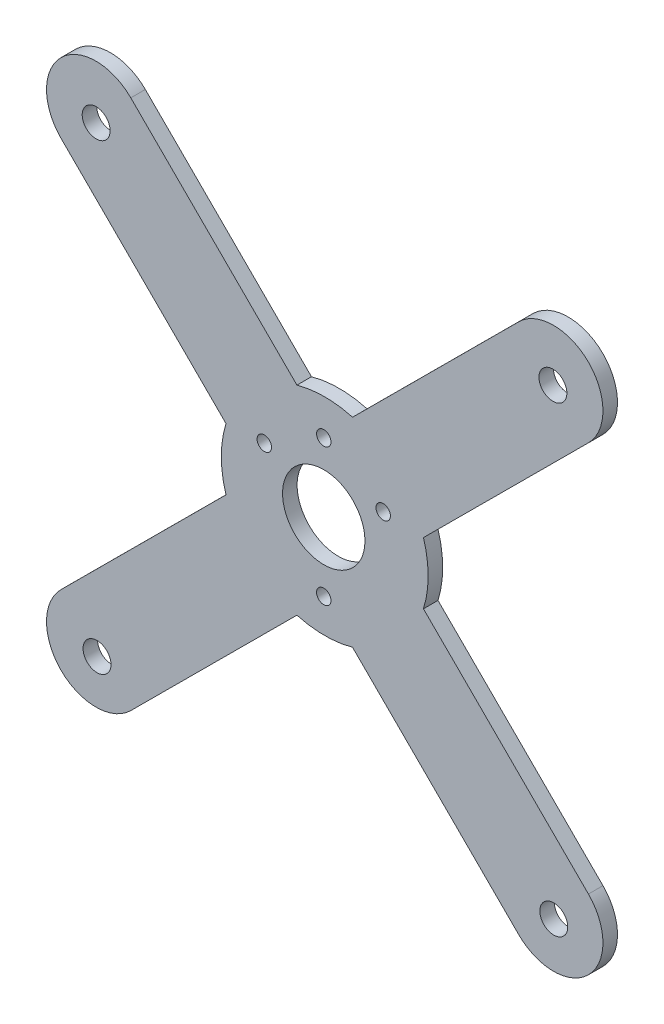
ISO-10303-21;
HEADER;
FILE_DESCRIPTION(('STEP AP214'),'2;1');
FILE_NAME('part.step','',(''),(''),'','','');
FILE_SCHEMA(('AUTOMOTIVE_DESIGN { 1 0 10303 214 1 1 1 1 }'));
ENDSEC;
DATA;
#1=APPLICATION_CONTEXT('core data for automotive mechanical design processes');
#2=APPLICATION_PROTOCOL_DEFINITION('international standard','automotive_design',2000,#1);
#3=PRODUCT_CONTEXT('',#1,'mechanical');
#4=PRODUCT('Part','Part','',(#3));
#5=PRODUCT_RELATED_PRODUCT_CATEGORY('part','',(#4));
#6=PRODUCT_DEFINITION_FORMATION('','',#4);
#7=PRODUCT_DEFINITION_CONTEXT('part definition',#1,'design');
#8=PRODUCT_DEFINITION('design','',#6,#7);
#9=PRODUCT_DEFINITION_SHAPE('','',#8);
#10=(LENGTH_UNIT() NAMED_UNIT(*) SI_UNIT(.MILLI.,.METRE.));
#11=(NAMED_UNIT(*) PLANE_ANGLE_UNIT() SI_UNIT($,.RADIAN.));
#12=(NAMED_UNIT(*) SI_UNIT($,.STERADIAN.) SOLID_ANGLE_UNIT());
#13=UNCERTAINTY_MEASURE_WITH_UNIT(LENGTH_MEASURE(1.E-05),#10,'distance_accuracy_value','');
#14=(GEOMETRIC_REPRESENTATION_CONTEXT(3) GLOBAL_UNCERTAINTY_ASSIGNED_CONTEXT((#13)) GLOBAL_UNIT_ASSIGNED_CONTEXT((#10,
#11,#12)) REPRESENTATION_CONTEXT('',''));
#15=CARTESIAN_POINT('',(0.,0.,0.));
#16=DIRECTION('',(0.,0.,1.));
#17=DIRECTION('',(1.,0.,0.));
#18=AXIS2_PLACEMENT_3D('',#15,#16,#17);
#19=CARTESIAN_POINT('',(-49.7743654585426,50.6103078211912,3.175));
#20=DIRECTION('',(0.,0.,-1.));
#21=DIRECTION('',(-1.,0.,0.));
#22=AXIS2_PLACEMENT_3D('',#19,#20,#21);
#23=PLANE('',#22);
#24=CARTESIAN_POINT('',(-49.7743654585426,50.6103078211912,3.175));
#25=DIRECTION('',(0.,0.,1.));
#26=DIRECTION('',(-1.,0.,0.));
#27=AXIS2_PLACEMENT_3D('',#24,#25,#26);
#28=CIRCLE('',#27,10.7897531368883);
#29=CARTESIAN_POINT('',(-42.1549727802943,58.2499169715107,3.175));
#30=VERTEX_POINT('',#29);
#31=CARTESIAN_POINT('',(-57.3937581367911,42.9706986708717,3.175));
#32=VERTEX_POINT('',#31);
#33=EDGE_CURVE('E212',#30,#32,#28,.T.);
#34=ORIENTED_EDGE('',*,*,#33,.T.);
#35=DIRECTION('',(0.708042997221225,-0.706169323948573,0.));
#36=VECTOR('',#35,1.);
#37=CARTESIAN_POINT('',(-57.3937581367911,42.9706986708717,3.175));
#38=LINE('',#37,#36);
#39=CARTESIAN_POINT('',(-21.3539668145918,7.02627838407185,3.175));
#40=VERTEX_POINT('',#39);
#41=EDGE_CURVE('E120',#32,#40,#38,.T.);
#42=ORIENTED_EDGE('',*,*,#41,.T.);
#43=CARTESIAN_POINT('',(0.212184023995116,0.287188930352053,3.175));
#44=DIRECTION('',(0.,0.,1.));
#45=DIRECTION('',(1.,0.,0.));
#46=AXIS2_PLACEMENT_3D('',#43,#44,#45);
#47=CIRCLE('',#46,22.5945610414967);
#48=CARTESIAN_POINT('',(-21.3539668145918,-6.45190052336774,3.175));
#49=VERTEX_POINT('',#48);
#50=EDGE_CURVE('E251',#40,#49,#47,.T.);
#51=ORIENTED_EDGE('',*,*,#50,.T.);
#52=DIRECTION('',(-0.708042997221225,-0.706169323948573,0.));
#53=VECTOR('',#52,1.);
#54=CARTESIAN_POINT('',(-57.3937581367911,-42.3963208101676,3.175));
#55=LINE('',#54,#53);
#56=CARTESIAN_POINT('',(-57.3937581367911,-42.3963208101676,3.175));
#57=VERTEX_POINT('',#56);
#58=EDGE_CURVE('E270',#49,#57,#55,.T.);
#59=ORIENTED_EDGE('',*,*,#58,.T.);
#60=CARTESIAN_POINT('',(-49.7743654585426,-50.0359299604871,3.175));
#61=DIRECTION('',(0.,0.,1.));
#62=DIRECTION('',(1.,0.,0.));
#63=AXIS2_PLACEMENT_3D('',#60,#61,#62);
#64=CIRCLE('',#63,10.7897531368883);
#65=CARTESIAN_POINT('',(-42.1549727802942,-57.6755391108066,3.175));
#66=VERTEX_POINT('',#65);
#67=EDGE_CURVE('E267',#57,#66,#64,.T.);
#68=ORIENTED_EDGE('',*,*,#67,.T.);
#69=DIRECTION('',(0.708042997221225,0.706169323948573,0.));
#70=VECTOR('',#69,1.);
#71=CARTESIAN_POINT('',(-42.1549727802943,-57.6755391108066,3.175));
#72=LINE('',#71,#70);
#73=CARTESIAN_POINT('',(-5.859634798099,-21.47624840959,3.175));
#74=VERTEX_POINT('',#73);
#75=EDGE_CURVE('E269',#66,#74,#72,.T.);
#76=ORIENTED_EDGE('',*,*,#75,.T.);
#77=CARTESIAN_POINT('',(0.212184023995116,0.287188930352053,3.175));
#78=DIRECTION('',(0.,0.,1.));
#79=DIRECTION('',(1.,0.,0.));
#80=AXIS2_PLACEMENT_3D('',#77,#78,#79);
#81=CIRCLE('',#80,22.5945610414967);
#82=CARTESIAN_POINT('',(6.28400284608923,-21.47624840959,3.175));
#83=VERTEX_POINT('',#82);
#84=EDGE_CURVE('E272',#74,#83,#81,.T.);
#85=ORIENTED_EDGE('',*,*,#84,.T.);
#86=DIRECTION('',(0.708042997221225,-0.706169323948573,0.));
#87=VECTOR('',#86,1.);
#88=CARTESIAN_POINT('',(42.5793408282845,-57.6755391108066,3.175));
#89=LINE('',#88,#87);
#90=CARTESIAN_POINT('',(42.5793408282845,-57.6755391108066,3.175));
#91=VERTEX_POINT('',#90);
#92=EDGE_CURVE('E278',#83,#91,#89,.T.);
#93=ORIENTED_EDGE('',*,*,#92,.T.);
#94=CARTESIAN_POINT('',(50.1987335065329,-50.035929960487,3.175));
#95=DIRECTION('',(0.,0.,1.));
#96=DIRECTION('',(-1.,0.,0.));
#97=AXIS2_PLACEMENT_3D('',#94,#95,#96);
#98=CIRCLE('',#97,10.7897531368883);
#99=CARTESIAN_POINT('',(57.8181261847813,-42.3963208101676,3.175));
#100=VERTEX_POINT('',#99);
#101=EDGE_CURVE('E280',#91,#100,#98,.T.);
#102=ORIENTED_EDGE('',*,*,#101,.T.);
#103=DIRECTION('',(-0.708042997221225,0.706169323948573,0.));
#104=VECTOR('',#103,1.);
#105=CARTESIAN_POINT('',(57.8181261847813,-42.3963208101676,3.175));
#106=LINE('',#105,#104);
#107=CARTESIAN_POINT('',(21.778334862582,-6.45190052336774,3.175));
#108=VERTEX_POINT('',#107);
#109=EDGE_CURVE('E282',#100,#108,#106,.T.);
#110=ORIENTED_EDGE('',*,*,#109,.T.);
#111=CARTESIAN_POINT('',(0.212184023995116,0.287188930352053,3.175));
#112=DIRECTION('',(0.,0.,1.));
#113=DIRECTION('',(1.,0.,0.));
#114=AXIS2_PLACEMENT_3D('',#111,#112,#113);
#115=CIRCLE('',#114,22.5945610414967);
#116=CARTESIAN_POINT('',(21.778334862582,7.02627838407184,3.175));
#117=VERTEX_POINT('',#116);
#118=EDGE_CURVE('E284',#108,#117,#115,.T.);
#119=ORIENTED_EDGE('',*,*,#118,.T.);
#120=DIRECTION('',(0.708042997221225,0.706169323948573,0.));
#121=VECTOR('',#120,1.);
#122=CARTESIAN_POINT('',(57.8181261847813,42.9706986708717,3.175));
#123=LINE('',#122,#121);
#124=CARTESIAN_POINT('',(57.8181261847813,42.9706986708717,3.175));
#125=VERTEX_POINT('',#124);
#126=EDGE_CURVE('E286',#117,#125,#123,.T.);
#127=ORIENTED_EDGE('',*,*,#126,.T.);
#128=CARTESIAN_POINT('',(50.1987335065329,50.6103078211912,3.175));
#129=DIRECTION('',(0.,0.,1.));
#130=DIRECTION('',(1.,0.,0.));
#131=AXIS2_PLACEMENT_3D('',#128,#129,#130);
#132=CIRCLE('',#131,10.7897531368883);
#133=CARTESIAN_POINT('',(42.5793408282845,58.2499169715107,3.175));
#134=VERTEX_POINT('',#133);
#135=EDGE_CURVE('E163',#125,#134,#132,.T.);
#136=ORIENTED_EDGE('',*,*,#135,.T.);
#137=DIRECTION('',(-0.708042997221225,-0.706169323948573,0.));
#138=VECTOR('',#137,1.);
#139=CARTESIAN_POINT('',(42.5793408282845,58.2499169715107,3.175));
#140=LINE('',#139,#138);
#141=CARTESIAN_POINT('',(6.28400284608923,22.0506262702941,3.175));
#142=VERTEX_POINT('',#141);
#143=EDGE_CURVE('E157',#134,#142,#140,.T.);
#144=ORIENTED_EDGE('',*,*,#143,.T.);
#145=CARTESIAN_POINT('',(0.212184023995116,0.287188930352053,3.175));
#146=DIRECTION('',(0.,0.,1.));
#147=DIRECTION('',(1.,0.,0.));
#148=AXIS2_PLACEMENT_3D('',#145,#146,#147);
#149=CIRCLE('',#148,22.5945610414967);
#150=CARTESIAN_POINT('',(-5.859634798099,22.0506262702941,3.175));
#151=VERTEX_POINT('',#150);
#152=EDGE_CURVE('E161',#142,#151,#149,.T.);
#153=ORIENTED_EDGE('',*,*,#152,.T.);
#154=DIRECTION('',(-0.708042997221225,0.706169323948573,0.));
#155=VECTOR('',#154,1.);
#156=CARTESIAN_POINT('',(-42.1549727802943,58.2499169715107,3.175));
#157=LINE('',#156,#155);
#158=EDGE_CURVE('E53',#151,#30,#157,.T.);
#159=ORIENTED_EDGE('',*,*,#158,.T.);
#160=EDGE_LOOP('',(#34,#42,#51,#59,#68,#76,#85,#93,#102,#110,#119,#127,#136,#144,#153,#159));
#161=FACE_BOUND('',#160,.T.);
#162=CARTESIAN_POINT('',(-49.7226597396435,49.7522118161619,3.175));
#163=DIRECTION('',(0.,0.,1.));
#164=DIRECTION('',(1.,0.,0.));
#165=AXIS2_PLACEMENT_3D('',#162,#163,#164);
#166=CIRCLE('',#165,3.05000000000001);
#167=CARTESIAN_POINT('',(-46.6726597396435,49.7522118161619,3.175));
#168=VERTEX_POINT('',#167);
#169=EDGE_CURVE('E185',#168,#168,#166,.T.);
#170=ORIENTED_EDGE('',*,*,#169,.F.);
#171=EDGE_LOOP('',(#170));
#172=FACE_BOUND('',#171,.T.);
#173=CARTESIAN_POINT('',(50.0628956848809,49.9959740344837,3.175));
#174=DIRECTION('',(0.,0.,1.));
#175=DIRECTION('',(-1.,0.,0.));
#176=AXIS2_PLACEMENT_3D('',#173,#174,#175);
#177=CIRCLE('',#176,3.05);
#178=CARTESIAN_POINT('',(47.0128956848809,49.9959740344837,3.175));
#179=VERTEX_POINT('',#178);
#180=EDGE_CURVE('E400',#179,#179,#177,.T.);
#181=ORIENTED_EDGE('',*,*,#180,.F.);
#182=EDGE_LOOP('',(#181));
#183=FACE_BOUND('',#182,.T.);
#184=CARTESIAN_POINT('',(50.250439225432,-50.8940259655163,3.175));
#185=DIRECTION('',(0.,0.,1.));
#186=DIRECTION('',(1.,0.,0.));
#187=AXIS2_PLACEMENT_3D('',#184,#185,#186);
#188=CIRCLE('',#187,3.05000000000002);
#189=CARTESIAN_POINT('',(53.3004392254321,-50.8940259655163,3.175));
#190=VERTEX_POINT('',#189);
#191=EDGE_CURVE('E394',#190,#190,#188,.T.);
#192=ORIENTED_EDGE('',*,*,#191,.F.);
#193=EDGE_LOOP('',(#192));
#194=FACE_BOUND('',#193,.T.);
#195=CARTESIAN_POINT('',(-49.5348861337291,-51.1415457768633,3.175));
#196=DIRECTION('',(0.,0.,1.));
#197=DIRECTION('',(-1.,0.,0.));
#198=AXIS2_PLACEMENT_3D('',#195,#196,#197);
#199=CIRCLE('',#198,3.05);
#200=CARTESIAN_POINT('',(-52.5848861337291,-51.1415457768633,3.175));
#201=VERTEX_POINT('',#200);
#202=EDGE_CURVE('E388',#201,#201,#199,.T.);
#203=ORIENTED_EDGE('',*,*,#202,.F.);
#204=EDGE_LOOP('',(#203));
#205=FACE_BOUND('',#204,.T.);
#206=CARTESIAN_POINT('',(0.,15.,3.175));
#207=DIRECTION('',(0.,0.,1.));
#208=DIRECTION('',(1.,0.,0.));
#209=AXIS2_PLACEMENT_3D('',#206,#207,#208);
#210=CIRCLE('',#209,1.57500000079265);
#211=CARTESIAN_POINT('',(1.57500000079265,15.,3.175));
#212=VERTEX_POINT('',#211);
#213=EDGE_CURVE('E382',#212,#212,#210,.T.);
#214=ORIENTED_EDGE('',*,*,#213,.F.);
#215=EDGE_LOOP('',(#214));
#216=FACE_BOUND('',#215,.T.);
#217=CARTESIAN_POINT('',(0.,0.,3.175));
#218=DIRECTION('',(0.,0.,1.));
#219=DIRECTION('',(1.,0.,0.));
#220=AXIS2_PLACEMENT_3D('',#217,#218,#219);
#221=CIRCLE('',#220,9.00000000079265);
#222=CARTESIAN_POINT('',(9.00000000079265,0.,3.175));
#223=VERTEX_POINT('',#222);
#224=EDGE_CURVE('E376',#223,#223,#221,.T.);
#225=ORIENTED_EDGE('',*,*,#224,.F.);
#226=EDGE_LOOP('',(#225));
#227=FACE_BOUND('',#226,.T.);
#228=CARTESIAN_POINT('',(-12.99,7.49999999999994,3.175));
#229=DIRECTION('',(0.,0.,1.));
#230=DIRECTION('',(1.,0.,0.));
#231=AXIS2_PLACEMENT_3D('',#228,#229,#230);
#232=CIRCLE('',#231,1.57500000079267);
#233=CARTESIAN_POINT('',(-11.4149999992073,7.49999999999994,3.175));
#234=VERTEX_POINT('',#233);
#235=EDGE_CURVE('E370',#234,#234,#232,.T.);
#236=ORIENTED_EDGE('',*,*,#235,.F.);
#237=EDGE_LOOP('',(#236));
#238=FACE_BOUND('',#237,.T.);
#239=CARTESIAN_POINT('',(12.99,7.49999999999997,3.175));
#240=DIRECTION('',(0.,0.,1.));
#241=DIRECTION('',(-1.,0.,0.));
#242=AXIS2_PLACEMENT_3D('',#239,#240,#241);
#243=CIRCLE('',#242,1.57500000079266);
#244=CARTESIAN_POINT('',(11.4149999992073,7.49999999999997,3.175));
#245=VERTEX_POINT('',#244);
#246=EDGE_CURVE('E364',#245,#245,#243,.T.);
#247=ORIENTED_EDGE('',*,*,#246,.F.);
#248=EDGE_LOOP('',(#247));
#249=FACE_BOUND('',#248,.T.);
#250=CARTESIAN_POINT('',(0.,-15.,3.175));
#251=DIRECTION('',(0.,0.,1.));
#252=DIRECTION('',(-1.,0.,0.));
#253=AXIS2_PLACEMENT_3D('',#250,#251,#252);
#254=CIRCLE('',#253,1.57500000079265);
#255=CARTESIAN_POINT('',(-1.57500000079265,-15.,3.175));
#256=VERTEX_POINT('',#255);
#257=EDGE_CURVE('E355',#256,#256,#254,.T.);
#258=ORIENTED_EDGE('',*,*,#257,.F.);
#259=EDGE_LOOP('',(#258));
#260=FACE_BOUND('',#259,.T.);
#261=ADVANCED_FACE('F36',(#161,#172,#183,#194,#205,#216,#227,#238,#249,#260),#23,.F.);
#262=CARTESIAN_POINT('',(-49.7743654585426,50.6103078211912,0.));
#263=DIRECTION('',(0.,0.,-1.));
#264=DIRECTION('',(-1.,0.,0.));
#265=AXIS2_PLACEMENT_3D('',#262,#263,#264);
#266=PLANE('',#265);
#267=CARTESIAN_POINT('',(12.99,7.49999999999997,0.));
#268=DIRECTION('',(0.,0.,1.));
#269=DIRECTION('',(-1.,0.,0.));
#270=AXIS2_PLACEMENT_3D('',#267,#268,#269);
#271=CIRCLE('',#270,1.57500000079266);
#272=CARTESIAN_POINT('',(11.4149999992073,7.49999999999997,0.));
#273=VERTEX_POINT('',#272);
#274=EDGE_CURVE('E361',#273,#273,#271,.T.);
#275=ORIENTED_EDGE('',*,*,#274,.T.);
#276=EDGE_LOOP('',(#275));
#277=FACE_BOUND('',#276,.T.);
#278=CARTESIAN_POINT('',(0.,0.,0.));
#279=DIRECTION('',(0.,0.,1.));
#280=DIRECTION('',(1.,0.,0.));
#281=AXIS2_PLACEMENT_3D('',#278,#279,#280);
#282=CIRCLE('',#281,9.00000000079265);
#283=CARTESIAN_POINT('',(9.00000000079265,0.,0.));
#284=VERTEX_POINT('',#283);
#285=EDGE_CURVE('E373',#284,#284,#282,.T.);
#286=ORIENTED_EDGE('',*,*,#285,.T.);
#287=EDGE_LOOP('',(#286));
#288=FACE_BOUND('',#287,.T.);
#289=CARTESIAN_POINT('',(-49.5348861337291,-51.1415457768633,0.));
#290=DIRECTION('',(0.,0.,1.));
#291=DIRECTION('',(-1.,0.,0.));
#292=AXIS2_PLACEMENT_3D('',#289,#290,#291);
#293=CIRCLE('',#292,3.05);
#294=CARTESIAN_POINT('',(-52.5848861337291,-51.1415457768633,0.));
#295=VERTEX_POINT('',#294);
#296=EDGE_CURVE('E385',#295,#295,#293,.T.);
#297=ORIENTED_EDGE('',*,*,#296,.T.);
#298=EDGE_LOOP('',(#297));
#299=FACE_BOUND('',#298,.T.);
#300=CARTESIAN_POINT('',(50.0628956848809,49.9959740344837,0.));
#301=DIRECTION('',(0.,0.,1.));
#302=DIRECTION('',(-1.,0.,0.));
#303=AXIS2_PLACEMENT_3D('',#300,#301,#302);
#304=CIRCLE('',#303,3.05);
#305=CARTESIAN_POINT('',(47.0128956848809,49.9959740344837,0.));
#306=VERTEX_POINT('',#305);
#307=EDGE_CURVE('E397',#306,#306,#304,.T.);
#308=ORIENTED_EDGE('',*,*,#307,.T.);
#309=EDGE_LOOP('',(#308));
#310=FACE_BOUND('',#309,.T.);
#311=CARTESIAN_POINT('',(-49.7743654585426,50.6103078211912,0.));
#312=DIRECTION('',(0.,0.,1.));
#313=DIRECTION('',(-1.,0.,0.));
#314=AXIS2_PLACEMENT_3D('',#311,#312,#313);
#315=CIRCLE('',#314,10.7897531368883);
#316=CARTESIAN_POINT('',(-42.1549727802943,58.2499169715107,0.));
#317=VERTEX_POINT('',#316);
#318=CARTESIAN_POINT('',(-57.3937581367911,42.9706986708717,0.));
#319=VERTEX_POINT('',#318);
#320=EDGE_CURVE('E181',#317,#319,#315,.T.);
#321=ORIENTED_EDGE('',*,*,#320,.F.);
#322=DIRECTION('',(-0.708042997221225,0.706169323948573,0.));
#323=VECTOR('',#322,1.);
#324=CARTESIAN_POINT('',(-42.1549727802943,58.2499169715107,0.));
#325=LINE('',#324,#323);
#326=CARTESIAN_POINT('',(-5.859634798099,22.0506262702941,0.));
#327=VERTEX_POINT('',#326);
#328=EDGE_CURVE('E112',#327,#317,#325,.T.);
#329=ORIENTED_EDGE('',*,*,#328,.F.);
#330=CARTESIAN_POINT('',(0.212184023995116,0.287188930352053,0.));
#331=DIRECTION('',(0.,0.,1.));
#332=DIRECTION('',(1.,0.,0.));
#333=AXIS2_PLACEMENT_3D('',#330,#331,#332);
#334=CIRCLE('',#333,22.5945610414967);
#335=CARTESIAN_POINT('',(6.28400284608923,22.0506262702941,0.));
#336=VERTEX_POINT('',#335);
#337=EDGE_CURVE('E106',#336,#327,#334,.T.);
#338=ORIENTED_EDGE('',*,*,#337,.F.);
#339=DIRECTION('',(-0.708042997221225,-0.706169323948573,0.));
#340=VECTOR('',#339,1.);
#341=CARTESIAN_POINT('',(42.5793408282845,58.2499169715107,0.));
#342=LINE('',#341,#340);
#343=CARTESIAN_POINT('',(42.5793408282845,58.2499169715107,0.));
#344=VERTEX_POINT('',#343);
#345=EDGE_CURVE('E171',#344,#336,#342,.T.);
#346=ORIENTED_EDGE('',*,*,#345,.F.);
#347=CARTESIAN_POINT('',(50.1987335065329,50.6103078211912,0.));
#348=DIRECTION('',(0.,0.,1.));
#349=DIRECTION('',(1.,0.,0.));
#350=AXIS2_PLACEMENT_3D('',#347,#348,#349);
#351=CIRCLE('',#350,10.7897531368883);
#352=CARTESIAN_POINT('',(57.8181261847813,42.9706986708717,0.));
#353=VERTEX_POINT('',#352);
#354=EDGE_CURVE('E207',#353,#344,#351,.T.);
#355=ORIENTED_EDGE('',*,*,#354,.F.);
#356=DIRECTION('',(0.708042997221225,0.706169323948573,0.));
#357=VECTOR('',#356,1.);
#358=CARTESIAN_POINT('',(57.8181261847813,42.9706986708717,0.));
#359=LINE('',#358,#357);
#360=CARTESIAN_POINT('',(21.778334862582,7.02627838407184,0.));
#361=VERTEX_POINT('',#360);
#362=EDGE_CURVE('E205',#361,#353,#359,.T.);
#363=ORIENTED_EDGE('',*,*,#362,.F.);
#364=CARTESIAN_POINT('',(0.212184023995116,0.287188930352053,0.));
#365=DIRECTION('',(0.,0.,1.));
#366=DIRECTION('',(1.,0.,0.));
#367=AXIS2_PLACEMENT_3D('',#364,#365,#366);
#368=CIRCLE('',#367,22.5945610414967);
#369=CARTESIAN_POINT('',(21.778334862582,-6.45190052336774,0.));
#370=VERTEX_POINT('',#369);
#371=EDGE_CURVE('E203',#370,#361,#368,.T.);
#372=ORIENTED_EDGE('',*,*,#371,.F.);
#373=DIRECTION('',(-0.708042997221225,0.706169323948573,0.));
#374=VECTOR('',#373,1.);
#375=CARTESIAN_POINT('',(57.8181261847813,-42.3963208101676,0.));
#376=LINE('',#375,#374);
#377=CARTESIAN_POINT('',(57.8181261847813,-42.3963208101676,0.));
#378=VERTEX_POINT('',#377);
#379=EDGE_CURVE('E201',#378,#370,#376,.T.);
#380=ORIENTED_EDGE('',*,*,#379,.F.);
#381=CARTESIAN_POINT('',(50.1987335065329,-50.035929960487,0.));
#382=DIRECTION('',(0.,0.,1.));
#383=DIRECTION('',(-1.,0.,0.));
#384=AXIS2_PLACEMENT_3D('',#381,#382,#383);
#385=CIRCLE('',#384,10.7897531368883);
#386=CARTESIAN_POINT('',(42.5793408282845,-57.6755391108066,0.));
#387=VERTEX_POINT('',#386);
#388=EDGE_CURVE('E199',#387,#378,#385,.T.);
#389=ORIENTED_EDGE('',*,*,#388,.F.);
#390=DIRECTION('',(0.708042997221225,-0.706169323948573,0.));
#391=VECTOR('',#390,1.);
#392=CARTESIAN_POINT('',(42.5793408282845,-57.6755391108066,0.));
#393=LINE('',#392,#391);
#394=CARTESIAN_POINT('',(6.28400284608923,-21.47624840959,0.));
#395=VERTEX_POINT('',#394);
#396=EDGE_CURVE('E197',#395,#387,#393,.T.);
#397=ORIENTED_EDGE('',*,*,#396,.F.);
#398=CARTESIAN_POINT('',(0.212184023995116,0.287188930352053,0.));
#399=DIRECTION('',(0.,0.,1.));
#400=DIRECTION('',(1.,0.,0.));
#401=AXIS2_PLACEMENT_3D('',#398,#399,#400);
#402=CIRCLE('',#401,22.5945610414967);
#403=CARTESIAN_POINT('',(-5.859634798099,-21.47624840959,0.));
#404=VERTEX_POINT('',#403);
#405=EDGE_CURVE('E195',#404,#395,#402,.T.);
#406=ORIENTED_EDGE('',*,*,#405,.F.);
#407=DIRECTION('',(0.708042997221225,0.706169323948573,0.));
#408=VECTOR('',#407,1.);
#409=CARTESIAN_POINT('',(-42.1549727802943,-57.6755391108066,0.));
#410=LINE('',#409,#408);
#411=CARTESIAN_POINT('',(-42.1549727802942,-57.6755391108066,0.));
#412=VERTEX_POINT('',#411);
#413=EDGE_CURVE('E193',#412,#404,#410,.T.);
#414=ORIENTED_EDGE('',*,*,#413,.F.);
#415=CARTESIAN_POINT('',(-49.7743654585426,-50.0359299604871,0.));
#416=DIRECTION('',(0.,0.,1.));
#417=DIRECTION('',(1.,0.,0.));
#418=AXIS2_PLACEMENT_3D('',#415,#416,#417);
#419=CIRCLE('',#418,10.7897531368883);
#420=CARTESIAN_POINT('',(-57.3937581367911,-42.3963208101676,0.));
#421=VERTEX_POINT('',#420);
#422=EDGE_CURVE('E191',#421,#412,#419,.T.);
#423=ORIENTED_EDGE('',*,*,#422,.F.);
#424=DIRECTION('',(-0.708042997221225,-0.706169323948573,0.));
#425=VECTOR('',#424,1.);
#426=CARTESIAN_POINT('',(-57.3937581367911,-42.3963208101676,0.));
#427=LINE('',#426,#425);
#428=CARTESIAN_POINT('',(-21.3539668145918,-6.45190052336774,0.));
#429=VERTEX_POINT('',#428);
#430=EDGE_CURVE('E189',#429,#421,#427,.T.);
#431=ORIENTED_EDGE('',*,*,#430,.F.);
#432=CARTESIAN_POINT('',(0.212184023995116,0.287188930352053,0.));
#433=DIRECTION('',(0.,0.,1.));
#434=DIRECTION('',(1.,0.,0.));
#435=AXIS2_PLACEMENT_3D('',#432,#433,#434);
#436=CIRCLE('',#435,22.5945610414967);
#437=CARTESIAN_POINT('',(-21.3539668145918,7.02627838407185,0.));
#438=VERTEX_POINT('',#437);
#439=EDGE_CURVE('E187',#438,#429,#436,.T.);
#440=ORIENTED_EDGE('',*,*,#439,.F.);
#441=DIRECTION('',(0.708042997221225,-0.706169323948573,0.));
#442=VECTOR('',#441,1.);
#443=CARTESIAN_POINT('',(-57.3937581367911,42.9706986708717,0.));
#444=LINE('',#443,#442);
#445=EDGE_CURVE('E184',#319,#438,#444,.T.);
#446=ORIENTED_EDGE('',*,*,#445,.F.);
#447=EDGE_LOOP('',(#321,#329,#338,#346,#355,#363,#372,#380,#389,#397,#406,#414,#423,#431,#440,#446));
#448=FACE_BOUND('',#447,.T.);
#449=CARTESIAN_POINT('',(-49.7226597396435,49.7522118161619,0.));
#450=DIRECTION('',(0.,0.,1.));
#451=DIRECTION('',(1.,0.,0.));
#452=AXIS2_PLACEMENT_3D('',#449,#450,#451);
#453=CIRCLE('',#452,3.05000000000001);
#454=CARTESIAN_POINT('',(-46.6726597396435,49.7522118161619,0.));
#455=VERTEX_POINT('',#454);
#456=EDGE_CURVE('E403',#455,#455,#453,.T.);
#457=ORIENTED_EDGE('',*,*,#456,.T.);
#458=EDGE_LOOP('',(#457));
#459=FACE_BOUND('',#458,.T.);
#460=CARTESIAN_POINT('',(50.250439225432,-50.8940259655163,0.));
#461=DIRECTION('',(0.,0.,1.));
#462=DIRECTION('',(1.,0.,0.));
#463=AXIS2_PLACEMENT_3D('',#460,#461,#462);
#464=CIRCLE('',#463,3.05000000000002);
#465=CARTESIAN_POINT('',(53.3004392254321,-50.8940259655163,0.));
#466=VERTEX_POINT('',#465);
#467=EDGE_CURVE('E391',#466,#466,#464,.T.);
#468=ORIENTED_EDGE('',*,*,#467,.T.);
#469=EDGE_LOOP('',(#468));
#470=FACE_BOUND('',#469,.T.);
#471=CARTESIAN_POINT('',(0.,15.,0.));
#472=DIRECTION('',(0.,0.,1.));
#473=DIRECTION('',(1.,0.,0.));
#474=AXIS2_PLACEMENT_3D('',#471,#472,#473);
#475=CIRCLE('',#474,1.57500000079265);
#476=CARTESIAN_POINT('',(1.57500000079265,15.,0.));
#477=VERTEX_POINT('',#476);
#478=EDGE_CURVE('E379',#477,#477,#475,.T.);
#479=ORIENTED_EDGE('',*,*,#478,.T.);
#480=EDGE_LOOP('',(#479));
#481=FACE_BOUND('',#480,.T.);
#482=CARTESIAN_POINT('',(-12.99,7.49999999999994,0.));
#483=DIRECTION('',(0.,0.,1.));
#484=DIRECTION('',(1.,0.,0.));
#485=AXIS2_PLACEMENT_3D('',#482,#483,#484);
#486=CIRCLE('',#485,1.57500000079267);
#487=CARTESIAN_POINT('',(-11.4149999992073,7.49999999999994,0.));
#488=VERTEX_POINT('',#487);
#489=EDGE_CURVE('E367',#488,#488,#486,.T.);
#490=ORIENTED_EDGE('',*,*,#489,.T.);
#491=EDGE_LOOP('',(#490));
#492=FACE_BOUND('',#491,.T.);
#493=CARTESIAN_POINT('',(0.,-15.,0.));
#494=DIRECTION('',(0.,0.,1.));
#495=DIRECTION('',(-1.,0.,0.));
#496=AXIS2_PLACEMENT_3D('',#493,#494,#495);
#497=CIRCLE('',#496,1.57500000079265);
#498=CARTESIAN_POINT('',(-1.57500000079265,-15.,0.));
#499=VERTEX_POINT('',#498);
#500=EDGE_CURVE('E358',#499,#499,#497,.T.);
#501=ORIENTED_EDGE('',*,*,#500,.T.);
#502=EDGE_LOOP('',(#501));
#503=FACE_BOUND('',#502,.T.);
#504=ADVANCED_FACE('F255',(#277,#288,#299,#310,#448,#459,#470,#481,#492,#503),#266,.T.);
#505=CARTESIAN_POINT('',(-49.7743654585426,50.6103078211912,3.175));
#506=DIRECTION('',(0.,0.,-1.));
#507=DIRECTION('',(-1.,0.,0.));
#508=AXIS2_PLACEMENT_3D('',#505,#506,#507);
#509=CYLINDRICAL_SURFACE('',#508,10.7897531368883);
#510=ORIENTED_EDGE('',*,*,#320,.T.);
#511=DIRECTION('',(0.,0.,-1.));
#512=VECTOR('',#511,1.);
#513=CARTESIAN_POINT('',(-57.3937581367911,42.9706986708717,3.175));
#514=LINE('',#513,#512);
#515=EDGE_CURVE('E11',#32,#319,#514,.T.);
#516=ORIENTED_EDGE('',*,*,#515,.F.);
#517=ORIENTED_EDGE('',*,*,#33,.F.);
#518=DIRECTION('',(0.,0.,-1.));
#519=VECTOR('',#518,1.);
#520=CARTESIAN_POINT('',(-42.1549727802943,58.2499169715107,3.175));
#521=LINE('',#520,#519);
#522=EDGE_CURVE('E177',#30,#317,#521,.T.);
#523=ORIENTED_EDGE('',*,*,#522,.T.);
#524=EDGE_LOOP('',(#510,#516,#517,#523));
#525=FACE_BOUND('',#524,.T.);
#526=ADVANCED_FACE('F38',(#525),#509,.T.);
#527=CARTESIAN_POINT('',(-57.3937581367911,42.9706986708717,3.175));
#528=DIRECTION('',(0.706169323948573,0.708042997221225,0.));
#529=DIRECTION('',(-0.708042997221225,0.706169323948573,0.));
#530=AXIS2_PLACEMENT_3D('',#527,#528,#529);
#531=PLANE('',#530);
#532=ORIENTED_EDGE('',*,*,#445,.T.);
#533=DIRECTION('',(0.,0.,-1.));
#534=VECTOR('',#533,1.);
#535=CARTESIAN_POINT('',(-21.3539668145918,7.02627838407185,3.175));
#536=LINE('',#535,#534);
#537=EDGE_CURVE('E45',#40,#438,#536,.T.);
#538=ORIENTED_EDGE('',*,*,#537,.F.);
#539=ORIENTED_EDGE('',*,*,#41,.F.);
#540=ORIENTED_EDGE('',*,*,#515,.T.);
#541=EDGE_LOOP('',(#532,#538,#539,#540));
#542=FACE_BOUND('',#541,.T.);
#543=ADVANCED_FACE('F614',(#542),#531,.F.);
#544=CARTESIAN_POINT('',(0.212184023995116,0.287188930352053,3.175));
#545=DIRECTION('',(0.,0.,-1.));
#546=DIRECTION('',(-1.,0.,0.));
#547=AXIS2_PLACEMENT_3D('',#544,#545,#546);
#548=CYLINDRICAL_SURFACE('',#547,22.5945610414967);
#549=ORIENTED_EDGE('',*,*,#439,.T.);
#550=DIRECTION('',(0.,0.,-1.));
#551=VECTOR('',#550,1.);
#552=CARTESIAN_POINT('',(-21.3539668145918,-6.45190052336774,3.175));
#553=LINE('',#552,#551);
#554=EDGE_CURVE('E243',#49,#429,#553,.T.);
#555=ORIENTED_EDGE('',*,*,#554,.F.);
#556=ORIENTED_EDGE('',*,*,#50,.F.);
#557=ORIENTED_EDGE('',*,*,#537,.T.);
#558=EDGE_LOOP('',(#549,#555,#556,#557));
#559=FACE_BOUND('',#558,.T.);
#560=ADVANCED_FACE('F249',(#559),#548,.T.);
#561=CARTESIAN_POINT('',(-57.3937581367911,-42.3963208101676,3.175));
#562=DIRECTION('',(0.706169323948573,-0.708042997221225,0.));
#563=DIRECTION('',(0.708042997221225,0.706169323948573,0.));
#564=AXIS2_PLACEMENT_3D('',#561,#562,#563);
#565=PLANE('',#564);
#566=ORIENTED_EDGE('',*,*,#430,.T.);
#567=DIRECTION('',(0.,0.,-1.));
#568=VECTOR('',#567,1.);
#569=CARTESIAN_POINT('',(-57.3937581367911,-42.3963208101676,3.175));
#570=LINE('',#569,#568);
#571=EDGE_CURVE('E240',#57,#421,#570,.T.);
#572=ORIENTED_EDGE('',*,*,#571,.F.);
#573=ORIENTED_EDGE('',*,*,#58,.F.);
#574=ORIENTED_EDGE('',*,*,#554,.T.);
#575=EDGE_LOOP('',(#566,#572,#573,#574));
#576=FACE_BOUND('',#575,.T.);
#577=ADVANCED_FACE('F261',(#576),#565,.F.);
#578=CARTESIAN_POINT('',(-49.7743654585426,-50.0359299604871,3.175));
#579=DIRECTION('',(0.,0.,-1.));
#580=DIRECTION('',(-1.,0.,0.));
#581=AXIS2_PLACEMENT_3D('',#578,#579,#580);
#582=CYLINDRICAL_SURFACE('',#581,10.7897531368883);
#583=ORIENTED_EDGE('',*,*,#422,.T.);
#584=DIRECTION('',(0.,0.,-1.));
#585=VECTOR('',#584,1.);
#586=CARTESIAN_POINT('',(-42.1549727802942,-57.6755391108066,3.175));
#587=LINE('',#586,#585);
#588=EDGE_CURVE('E237',#66,#412,#587,.T.);
#589=ORIENTED_EDGE('',*,*,#588,.F.);
#590=ORIENTED_EDGE('',*,*,#67,.F.);
#591=ORIENTED_EDGE('',*,*,#571,.T.);
#592=EDGE_LOOP('',(#583,#589,#590,#591));
#593=FACE_BOUND('',#592,.T.);
#594=ADVANCED_FACE('F265',(#593),#582,.T.);
#595=CARTESIAN_POINT('',(-42.1549727802943,-57.6755391108066,3.175));
#596=DIRECTION('',(-0.706169323948573,0.708042997221225,0.));
#597=DIRECTION('',(-0.708042997221225,-0.706169323948573,0.));
#598=AXIS2_PLACEMENT_3D('',#595,#596,#597);
#599=PLANE('',#598);
#600=ORIENTED_EDGE('',*,*,#413,.T.);
#601=DIRECTION('',(0.,0.,-1.));
#602=VECTOR('',#601,1.);
#603=CARTESIAN_POINT('',(-5.859634798099,-21.47624840959,3.175));
#604=LINE('',#603,#602);
#605=EDGE_CURVE('E234',#74,#404,#604,.T.);
#606=ORIENTED_EDGE('',*,*,#605,.F.);
#607=ORIENTED_EDGE('',*,*,#75,.F.);
#608=ORIENTED_EDGE('',*,*,#588,.T.);
#609=EDGE_LOOP('',(#600,#606,#607,#608));
#610=FACE_BOUND('',#609,.T.);
#611=ADVANCED_FACE('F575',(#610),#599,.F.);
#612=CARTESIAN_POINT('',(0.212184023995116,0.287188930352053,3.175));
#613=DIRECTION('',(0.,0.,-1.));
#614=DIRECTION('',(-1.,0.,0.));
#615=AXIS2_PLACEMENT_3D('',#612,#613,#614);
#616=CYLINDRICAL_SURFACE('',#615,22.5945610414967);
#617=ORIENTED_EDGE('',*,*,#405,.T.);
#618=DIRECTION('',(0.,0.,-1.));
#619=VECTOR('',#618,1.);
#620=CARTESIAN_POINT('',(6.28400284608923,-21.47624840959,3.175));
#621=LINE('',#620,#619);
#622=EDGE_CURVE('E231',#83,#395,#621,.T.);
#623=ORIENTED_EDGE('',*,*,#622,.F.);
#624=ORIENTED_EDGE('',*,*,#84,.F.);
#625=ORIENTED_EDGE('',*,*,#605,.T.);
#626=EDGE_LOOP('',(#617,#623,#624,#625));
#627=FACE_BOUND('',#626,.T.);
#628=ADVANCED_FACE('F564',(#627),#616,.T.);
#629=CARTESIAN_POINT('',(42.5793408282845,-57.6755391108066,3.175));
#630=DIRECTION('',(0.706169323948573,0.708042997221225,0.));
#631=DIRECTION('',(-0.708042997221225,0.706169323948573,0.));
#632=AXIS2_PLACEMENT_3D('',#629,#630,#631);
#633=PLANE('',#632);
#634=ORIENTED_EDGE('',*,*,#396,.T.);
#635=DIRECTION('',(0.,0.,-1.));
#636=VECTOR('',#635,1.);
#637=CARTESIAN_POINT('',(42.5793408282845,-57.6755391108066,3.175));
#638=LINE('',#637,#636);
#639=EDGE_CURVE('E228',#91,#387,#638,.T.);
#640=ORIENTED_EDGE('',*,*,#639,.F.);
#641=ORIENTED_EDGE('',*,*,#92,.F.);
#642=ORIENTED_EDGE('',*,*,#622,.T.);
#643=EDGE_LOOP('',(#634,#640,#641,#642));
#644=FACE_BOUND('',#643,.T.);
#645=ADVANCED_FACE('F553',(#644),#633,.F.);
#646=CARTESIAN_POINT('',(50.1987335065329,-50.035929960487,3.175));
#647=DIRECTION('',(0.,0.,-1.));
#648=DIRECTION('',(-1.,0.,0.));
#649=AXIS2_PLACEMENT_3D('',#646,#647,#648);
#650=CYLINDRICAL_SURFACE('',#649,10.7897531368883);
#651=ORIENTED_EDGE('',*,*,#388,.T.);
#652=DIRECTION('',(0.,0.,-1.));
#653=VECTOR('',#652,1.);
#654=CARTESIAN_POINT('',(57.8181261847813,-42.3963208101676,3.175));
#655=LINE('',#654,#653);
#656=EDGE_CURVE('E225',#100,#378,#655,.T.);
#657=ORIENTED_EDGE('',*,*,#656,.F.);
#658=ORIENTED_EDGE('',*,*,#101,.F.);
#659=ORIENTED_EDGE('',*,*,#639,.T.);
#660=EDGE_LOOP('',(#651,#657,#658,#659));
#661=FACE_BOUND('',#660,.T.);
#662=ADVANCED_FACE('F542',(#661),#650,.T.);
#663=CARTESIAN_POINT('',(57.8181261847813,-42.3963208101676,3.175));
#664=DIRECTION('',(-0.706169323948573,-0.708042997221225,0.));
#665=DIRECTION('',(0.708042997221225,-0.706169323948573,0.));
#666=AXIS2_PLACEMENT_3D('',#663,#664,#665);
#667=PLANE('',#666);
#668=ORIENTED_EDGE('',*,*,#379,.T.);
#669=DIRECTION('',(0.,0.,-1.));
#670=VECTOR('',#669,1.);
#671=CARTESIAN_POINT('',(21.778334862582,-6.45190052336774,3.175));
#672=LINE('',#671,#670);
#673=EDGE_CURVE('E222',#108,#370,#672,.T.);
#674=ORIENTED_EDGE('',*,*,#673,.F.);
#675=ORIENTED_EDGE('',*,*,#109,.F.);
#676=ORIENTED_EDGE('',*,*,#656,.T.);
#677=EDGE_LOOP('',(#668,#674,#675,#676));
#678=FACE_BOUND('',#677,.T.);
#679=ADVANCED_FACE('F531',(#678),#667,.F.);
#680=CARTESIAN_POINT('',(0.212184023995116,0.287188930352053,3.175));
#681=DIRECTION('',(0.,0.,-1.));
#682=DIRECTION('',(-1.,0.,0.));
#683=AXIS2_PLACEMENT_3D('',#680,#681,#682);
#684=CYLINDRICAL_SURFACE('',#683,22.5945610414967);
#685=ORIENTED_EDGE('',*,*,#371,.T.);
#686=DIRECTION('',(0.,0.,-1.));
#687=VECTOR('',#686,1.);
#688=CARTESIAN_POINT('',(21.778334862582,7.02627838407184,3.175));
#689=LINE('',#688,#687);
#690=EDGE_CURVE('E219',#117,#361,#689,.T.);
#691=ORIENTED_EDGE('',*,*,#690,.F.);
#692=ORIENTED_EDGE('',*,*,#118,.F.);
#693=ORIENTED_EDGE('',*,*,#673,.T.);
#694=EDGE_LOOP('',(#685,#691,#692,#693));
#695=FACE_BOUND('',#694,.T.);
#696=ADVANCED_FACE('F521',(#695),#684,.T.);
#697=CARTESIAN_POINT('',(57.8181261847813,42.9706986708717,3.175));
#698=DIRECTION('',(-0.706169323948573,0.708042997221225,0.));
#699=DIRECTION('',(-0.708042997221225,-0.706169323948573,0.));
#700=AXIS2_PLACEMENT_3D('',#697,#698,#699);
#701=PLANE('',#700);
#702=ORIENTED_EDGE('',*,*,#362,.T.);
#703=DIRECTION('',(0.,0.,-1.));
#704=VECTOR('',#703,1.);
#705=CARTESIAN_POINT('',(57.8181261847813,42.9706986708717,3.175));
#706=LINE('',#705,#704);
#707=EDGE_CURVE('E216',#125,#353,#706,.T.);
#708=ORIENTED_EDGE('',*,*,#707,.F.);
#709=ORIENTED_EDGE('',*,*,#126,.F.);
#710=ORIENTED_EDGE('',*,*,#690,.T.);
#711=EDGE_LOOP('',(#702,#708,#709,#710));
#712=FACE_BOUND('',#711,.T.);
#713=ADVANCED_FACE('F292',(#712),#701,.F.);
#714=CARTESIAN_POINT('',(50.1987335065329,50.6103078211912,3.175));
#715=DIRECTION('',(0.,0.,-1.));
#716=DIRECTION('',(-1.,0.,0.));
#717=AXIS2_PLACEMENT_3D('',#714,#715,#716);
#718=CYLINDRICAL_SURFACE('',#717,10.7897531368883);
#719=ORIENTED_EDGE('',*,*,#354,.T.);
#720=DIRECTION('',(0.,0.,-1.));
#721=VECTOR('',#720,1.);
#722=CARTESIAN_POINT('',(42.5793408282845,58.2499169715107,3.175));
#723=LINE('',#722,#721);
#724=EDGE_CURVE('E172',#134,#344,#723,.T.);
#725=ORIENTED_EDGE('',*,*,#724,.F.);
#726=ORIENTED_EDGE('',*,*,#135,.F.);
#727=ORIENTED_EDGE('',*,*,#707,.T.);
#728=EDGE_LOOP('',(#719,#725,#726,#727));
#729=FACE_BOUND('',#728,.T.);
#730=ADVANCED_FACE('F296',(#729),#718,.T.);
#731=CARTESIAN_POINT('',(42.5793408282845,58.2499169715107,3.175));
#732=DIRECTION('',(0.706169323948573,-0.708042997221225,0.));
#733=DIRECTION('',(0.708042997221225,0.706169323948573,0.));
#734=AXIS2_PLACEMENT_3D('',#731,#732,#733);
#735=PLANE('',#734);
#736=ORIENTED_EDGE('',*,*,#345,.T.);
#737=DIRECTION('',(0.,0.,-1.));
#738=VECTOR('',#737,1.);
#739=CARTESIAN_POINT('',(6.28400284608923,22.0506262702941,3.175));
#740=LINE('',#739,#738);
#741=EDGE_CURVE('E168',#142,#336,#740,.T.);
#742=ORIENTED_EDGE('',*,*,#741,.F.);
#743=ORIENTED_EDGE('',*,*,#143,.F.);
#744=ORIENTED_EDGE('',*,*,#724,.T.);
#745=EDGE_LOOP('',(#736,#742,#743,#744));
#746=FACE_BOUND('',#745,.T.);
#747=ADVANCED_FACE('F169',(#746),#735,.F.);
#748=CARTESIAN_POINT('',(0.212184023995116,0.287188930352053,3.175));
#749=DIRECTION('',(0.,0.,-1.));
#750=DIRECTION('',(-1.,0.,0.));
#751=AXIS2_PLACEMENT_3D('',#748,#749,#750);
#752=CYLINDRICAL_SURFACE('',#751,22.5945610414967);
#753=ORIENTED_EDGE('',*,*,#337,.T.);
#754=DIRECTION('',(0.,0.,-1.));
#755=VECTOR('',#754,1.);
#756=CARTESIAN_POINT('',(-5.859634798099,22.0506262702941,3.175));
#757=LINE('',#756,#755);
#758=EDGE_CURVE('E173',#151,#327,#757,.T.);
#759=ORIENTED_EDGE('',*,*,#758,.F.);
#760=ORIENTED_EDGE('',*,*,#152,.F.);
#761=ORIENTED_EDGE('',*,*,#741,.T.);
#762=EDGE_LOOP('',(#753,#759,#760,#761));
#763=FACE_BOUND('',#762,.T.);
#764=ADVANCED_FACE('F175',(#763),#752,.T.);
#765=CARTESIAN_POINT('',(-42.1549727802943,58.2499169715107,3.175));
#766=DIRECTION('',(-0.706169323948573,-0.708042997221225,0.));
#767=DIRECTION('',(0.708042997221225,-0.706169323948573,0.));
#768=AXIS2_PLACEMENT_3D('',#765,#766,#767);
#769=PLANE('',#768);
#770=ORIENTED_EDGE('',*,*,#328,.T.);
#771=ORIENTED_EDGE('',*,*,#522,.F.);
#772=ORIENTED_EDGE('',*,*,#158,.F.);
#773=ORIENTED_EDGE('',*,*,#758,.T.);
#774=EDGE_LOOP('',(#770,#771,#772,#773));
#775=FACE_BOUND('',#774,.T.);
#776=ADVANCED_FACE('F300',(#775),#769,.F.);
#777=CARTESIAN_POINT('',(-49.7226597396435,49.7522118161619,3.175));
#778=DIRECTION('',(0.,0.,-1.));
#779=DIRECTION('',(-1.,0.,0.));
#780=AXIS2_PLACEMENT_3D('',#777,#778,#779);
#781=CYLINDRICAL_SURFACE('',#780,3.05000000000001);
#782=ORIENTED_EDGE('',*,*,#169,.T.);
#783=EDGE_LOOP('',(#782));
#784=FACE_BOUND('',#783,.T.);
#785=ORIENTED_EDGE('',*,*,#456,.F.);
#786=EDGE_LOOP('',(#785));
#787=FACE_BOUND('',#786,.T.);
#788=ADVANCED_FACE('F302',(#784,#787),#781,.F.);
#789=CARTESIAN_POINT('',(50.0628956848809,49.9959740344837,3.175));
#790=DIRECTION('',(0.,0.,-1.));
#791=DIRECTION('',(-1.,0.,0.));
#792=AXIS2_PLACEMENT_3D('',#789,#790,#791);
#793=CYLINDRICAL_SURFACE('',#792,3.05);
#794=ORIENTED_EDGE('',*,*,#180,.T.);
#795=EDGE_LOOP('',(#794));
#796=FACE_BOUND('',#795,.T.);
#797=ORIENTED_EDGE('',*,*,#307,.F.);
#798=EDGE_LOOP('',(#797));
#799=FACE_BOUND('',#798,.T.);
#800=ADVANCED_FACE('F308',(#796,#799),#793,.F.);
#801=CARTESIAN_POINT('',(50.250439225432,-50.8940259655163,3.175));
#802=DIRECTION('',(0.,0.,-1.));
#803=DIRECTION('',(-1.,0.,0.));
#804=AXIS2_PLACEMENT_3D('',#801,#802,#803);
#805=CYLINDRICAL_SURFACE('',#804,3.05000000000002);
#806=ORIENTED_EDGE('',*,*,#191,.T.);
#807=EDGE_LOOP('',(#806));
#808=FACE_BOUND('',#807,.T.);
#809=ORIENTED_EDGE('',*,*,#467,.F.);
#810=EDGE_LOOP('',(#809));
#811=FACE_BOUND('',#810,.T.);
#812=ADVANCED_FACE('F322',(#808,#811),#805,.F.);
#813=CARTESIAN_POINT('',(-49.5348861337291,-51.1415457768633,3.175));
#814=DIRECTION('',(0.,0.,-1.));
#815=DIRECTION('',(-1.,0.,0.));
#816=AXIS2_PLACEMENT_3D('',#813,#814,#815);
#817=CYLINDRICAL_SURFACE('',#816,3.05);
#818=ORIENTED_EDGE('',*,*,#202,.T.);
#819=EDGE_LOOP('',(#818));
#820=FACE_BOUND('',#819,.T.);
#821=ORIENTED_EDGE('',*,*,#296,.F.);
#822=EDGE_LOOP('',(#821));
#823=FACE_BOUND('',#822,.T.);
#824=ADVANCED_FACE('F326',(#820,#823),#817,.F.);
#825=CARTESIAN_POINT('',(0.,15.,3.175));
#826=DIRECTION('',(0.,0.,-1.));
#827=DIRECTION('',(-1.,0.,0.));
#828=AXIS2_PLACEMENT_3D('',#825,#826,#827);
#829=CYLINDRICAL_SURFACE('',#828,1.57500000079265);
#830=ORIENTED_EDGE('',*,*,#213,.T.);
#831=EDGE_LOOP('',(#830));
#832=FACE_BOUND('',#831,.T.);
#833=ORIENTED_EDGE('',*,*,#478,.F.);
#834=EDGE_LOOP('',(#833));
#835=FACE_BOUND('',#834,.T.);
#836=ADVANCED_FACE('F330',(#832,#835),#829,.F.);
#837=CARTESIAN_POINT('',(0.,0.,3.175));
#838=DIRECTION('',(0.,0.,-1.));
#839=DIRECTION('',(-1.,0.,0.));
#840=AXIS2_PLACEMENT_3D('',#837,#838,#839);
#841=CYLINDRICAL_SURFACE('',#840,9.00000000079265);
#842=ORIENTED_EDGE('',*,*,#224,.T.);
#843=EDGE_LOOP('',(#842));
#844=FACE_BOUND('',#843,.T.);
#845=ORIENTED_EDGE('',*,*,#285,.F.);
#846=EDGE_LOOP('',(#845));
#847=FACE_BOUND('',#846,.T.);
#848=ADVANCED_FACE('F334',(#844,#847),#841,.F.);
#849=CARTESIAN_POINT('',(-12.99,7.49999999999994,3.175));
#850=DIRECTION('',(0.,0.,-1.));
#851=DIRECTION('',(-1.,0.,0.));
#852=AXIS2_PLACEMENT_3D('',#849,#850,#851);
#853=CYLINDRICAL_SURFACE('',#852,1.57500000079267);
#854=ORIENTED_EDGE('',*,*,#235,.T.);
#855=EDGE_LOOP('',(#854));
#856=FACE_BOUND('',#855,.T.);
#857=ORIENTED_EDGE('',*,*,#489,.F.);
#858=EDGE_LOOP('',(#857));
#859=FACE_BOUND('',#858,.T.);
#860=ADVANCED_FACE('F338',(#856,#859),#853,.F.);
#861=CARTESIAN_POINT('',(12.99,7.49999999999997,3.175));
#862=DIRECTION('',(0.,0.,-1.));
#863=DIRECTION('',(-1.,0.,0.));
#864=AXIS2_PLACEMENT_3D('',#861,#862,#863);
#865=CYLINDRICAL_SURFACE('',#864,1.57500000079266);
#866=ORIENTED_EDGE('',*,*,#246,.T.);
#867=EDGE_LOOP('',(#866));
#868=FACE_BOUND('',#867,.T.);
#869=ORIENTED_EDGE('',*,*,#274,.F.);
#870=EDGE_LOOP('',(#869));
#871=FACE_BOUND('',#870,.T.);
#872=ADVANCED_FACE('F342',(#868,#871),#865,.F.);
#873=CARTESIAN_POINT('',(0.,-15.,3.175));
#874=DIRECTION('',(0.,0.,-1.));
#875=DIRECTION('',(-1.,0.,0.));
#876=AXIS2_PLACEMENT_3D('',#873,#874,#875);
#877=CYLINDRICAL_SURFACE('',#876,1.57500000079265);
#878=ORIENTED_EDGE('',*,*,#257,.T.);
#879=EDGE_LOOP('',(#878));
#880=FACE_BOUND('',#879,.T.);
#881=ORIENTED_EDGE('',*,*,#500,.F.);
#882=EDGE_LOOP('',(#881));
#883=FACE_BOUND('',#882,.T.);
#884=ADVANCED_FACE('F346',(#880,#883),#877,.F.);
#885=CLOSED_SHELL('',(#261,#504,#526,#543,#560,#577,#594,#611,#628,#645,#662,#679,#696,#713,
#730,#747,#764,#776,#788,#800,#812,#824,#836,#848,#860,#872,#884));
#886=MANIFOLD_SOLID_BREP('B2',#885);
#887=ADVANCED_BREP_SHAPE_REPRESENTATION('',(#18,#886),#14);
#888=SHAPE_DEFINITION_REPRESENTATION(#9,#887);
ENDSEC;
END-ISO-10303-21;
